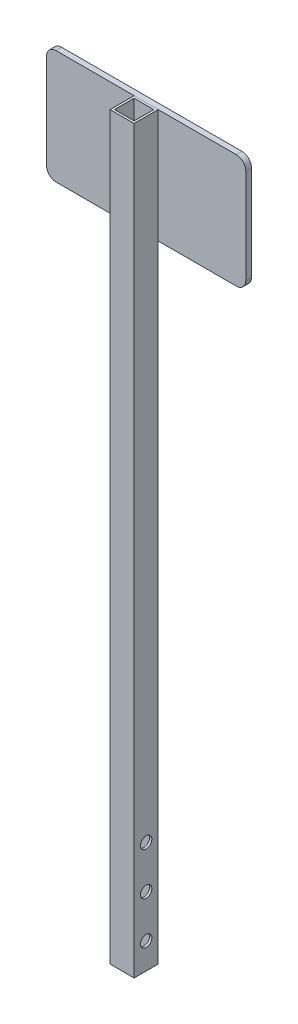
ISO-10303-21;
HEADER;
FILE_DESCRIPTION(('STEP AP214'),'2;1');
FILE_NAME('part.step','',(''),(''),'','','');
FILE_SCHEMA(('AUTOMOTIVE_DESIGN { 1 0 10303 214 1 1 1 1 }'));
ENDSEC;
DATA;
#1=APPLICATION_CONTEXT('core data for automotive mechanical design processes');
#2=APPLICATION_PROTOCOL_DEFINITION('international standard','automotive_design',2000,#1);
#3=PRODUCT_CONTEXT('',#1,'mechanical');
#4=PRODUCT('Part','Part','',(#3));
#5=PRODUCT_RELATED_PRODUCT_CATEGORY('part','',(#4));
#6=PRODUCT_DEFINITION_FORMATION('','',#4);
#7=PRODUCT_DEFINITION_CONTEXT('part definition',#1,'design');
#8=PRODUCT_DEFINITION('design','',#6,#7);
#9=PRODUCT_DEFINITION_SHAPE('','',#8);
#10=(LENGTH_UNIT() NAMED_UNIT(*) SI_UNIT(.MILLI.,.METRE.));
#11=(NAMED_UNIT(*) PLANE_ANGLE_UNIT() SI_UNIT($,.RADIAN.));
#12=(NAMED_UNIT(*) SI_UNIT($,.STERADIAN.) SOLID_ANGLE_UNIT());
#13=UNCERTAINTY_MEASURE_WITH_UNIT(LENGTH_MEASURE(1.E-05),#10,'distance_accuracy_value','');
#14=(GEOMETRIC_REPRESENTATION_CONTEXT(3) GLOBAL_UNCERTAINTY_ASSIGNED_CONTEXT((#13)) GLOBAL_UNIT_ASSIGNED_CONTEXT((#10,
#11,#12)) REPRESENTATION_CONTEXT('',''));
#15=CARTESIAN_POINT('',(0.,0.,0.));
#16=DIRECTION('',(0.,0.,1.));
#17=DIRECTION('',(1.,0.,0.));
#18=AXIS2_PLACEMENT_3D('',#15,#16,#17);
#19=CARTESIAN_POINT('',(47.5,-55.,-9.35000000000002));
#20=DIRECTION('',(0.,0.,1.));
#21=DIRECTION('',(0.,-1.,0.));
#22=AXIS2_PLACEMENT_3D('',#19,#20,#21);
#23=CYLINDRICAL_SURFACE('',#22,4.99999999999999);
#24=CARTESIAN_POINT('',(47.5,-55.,-6.35000000000002));
#25=DIRECTION('',(0.,0.,-1.));
#26=DIRECTION('',(0.,-1.,0.));
#27=AXIS2_PLACEMENT_3D('',#24,#25,#26);
#28=CIRCLE('',#27,4.99999999999999);
#29=CARTESIAN_POINT('',(52.5,-55.,-6.35000000000002));
#30=VERTEX_POINT('',#29);
#31=CARTESIAN_POINT('',(47.5,-60.,-6.35000000000003));
#32=VERTEX_POINT('',#31);
#33=EDGE_CURVE('E138',#30,#32,#28,.T.);
#34=ORIENTED_EDGE('',*,*,#33,.T.);
#35=DIRECTION('',(0.,0.,1.));
#36=VECTOR('',#35,1.);
#37=CARTESIAN_POINT('',(47.5,-60.,-9.35000000000003));
#38=LINE('',#37,#36);
#39=CARTESIAN_POINT('',(47.5,-60.,-9.35000000000003));
#40=VERTEX_POINT('',#39);
#41=EDGE_CURVE('E12',#40,#32,#38,.T.);
#42=ORIENTED_EDGE('',*,*,#41,.F.);
#43=CARTESIAN_POINT('',(47.5,-55.,-9.35000000000002));
#44=DIRECTION('',(0.,0.,-1.));
#45=DIRECTION('',(0.,-1.,0.));
#46=AXIS2_PLACEMENT_3D('',#43,#44,#45);
#47=CIRCLE('',#46,4.99999999999999);
#48=CARTESIAN_POINT('',(52.5,-55.,-9.35000000000002));
#49=VERTEX_POINT('',#48);
#50=EDGE_CURVE('E152',#49,#40,#47,.T.);
#51=ORIENTED_EDGE('',*,*,#50,.F.);
#52=DIRECTION('',(0.,0.,1.));
#53=VECTOR('',#52,1.);
#54=CARTESIAN_POINT('',(52.5,-55.,-9.35000000000002));
#55=LINE('',#54,#53);
#56=EDGE_CURVE('E134',#49,#30,#55,.T.);
#57=ORIENTED_EDGE('',*,*,#56,.T.);
#58=EDGE_LOOP('',(#34,#42,#51,#57));
#59=FACE_BOUND('',#58,.T.);
#60=ADVANCED_FACE('F42',(#59),#23,.T.);
#61=CARTESIAN_POINT('',(47.5,-60.,-9.35000000000003));
#62=DIRECTION('',(0.,1.,0.));
#63=DIRECTION('',(0.,0.,1.));
#64=AXIS2_PLACEMENT_3D('',#61,#62,#63);
#65=PLANE('',#64);
#66=DIRECTION('',(-1.,0.,0.));
#67=VECTOR('',#66,1.);
#68=CARTESIAN_POINT('',(47.5,-60.,-6.35000000000003));
#69=LINE('',#68,#67);
#70=CARTESIAN_POINT('',(-47.5,-60.,-6.35000000000003));
#71=VERTEX_POINT('',#70);
#72=EDGE_CURVE('E141',#32,#71,#69,.T.);
#73=ORIENTED_EDGE('',*,*,#72,.T.);
#74=DIRECTION('',(0.,0.,1.));
#75=VECTOR('',#74,1.);
#76=CARTESIAN_POINT('',(-47.5,-60.,-9.35000000000003));
#77=LINE('',#76,#75);
#78=CARTESIAN_POINT('',(-47.5,-60.,-9.35000000000003));
#79=VERTEX_POINT('',#78);
#80=EDGE_CURVE('E50',#79,#71,#77,.T.);
#81=ORIENTED_EDGE('',*,*,#80,.F.);
#82=DIRECTION('',(-1.,0.,0.));
#83=VECTOR('',#82,1.);
#84=CARTESIAN_POINT('',(47.5,-60.,-9.35000000000003));
#85=LINE('',#84,#83);
#86=EDGE_CURVE('E101',#40,#79,#85,.T.);
#87=ORIENTED_EDGE('',*,*,#86,.F.);
#88=ORIENTED_EDGE('',*,*,#41,.T.);
#89=EDGE_LOOP('',(#73,#81,#87,#88));
#90=FACE_BOUND('',#89,.T.);
#91=ADVANCED_FACE('F187',(#90),#65,.F.);
#92=CARTESIAN_POINT('',(-47.5,-55.,-9.35000000000002));
#93=DIRECTION('',(0.,0.,1.));
#94=DIRECTION('',(0.,-1.,0.));
#95=AXIS2_PLACEMENT_3D('',#92,#93,#94);
#96=CYLINDRICAL_SURFACE('',#95,4.99999999999999);
#97=CARTESIAN_POINT('',(-47.5,-55.,-6.35000000000002));
#98=DIRECTION('',(0.,0.,-1.));
#99=DIRECTION('',(0.,1.,0.));
#100=AXIS2_PLACEMENT_3D('',#97,#98,#99);
#101=CIRCLE('',#100,4.99999999999999);
#102=CARTESIAN_POINT('',(-52.5,-55.,-6.35000000000002));
#103=VERTEX_POINT('',#102);
#104=EDGE_CURVE('E143',#71,#103,#101,.T.);
#105=ORIENTED_EDGE('',*,*,#104,.T.);
#106=DIRECTION('',(0.,0.,1.));
#107=VECTOR('',#106,1.);
#108=CARTESIAN_POINT('',(-52.5,-55.,-9.35000000000002));
#109=LINE('',#108,#107);
#110=CARTESIAN_POINT('',(-52.5,-55.,-9.35000000000002));
#111=VERTEX_POINT('',#110);
#112=EDGE_CURVE('E159',#111,#103,#109,.T.);
#113=ORIENTED_EDGE('',*,*,#112,.F.);
#114=CARTESIAN_POINT('',(-47.5,-55.,-9.35000000000002));
#115=DIRECTION('',(0.,0.,-1.));
#116=DIRECTION('',(0.,1.,0.));
#117=AXIS2_PLACEMENT_3D('',#114,#115,#116);
#118=CIRCLE('',#117,4.99999999999999);
#119=EDGE_CURVE('E167',#79,#111,#118,.T.);
#120=ORIENTED_EDGE('',*,*,#119,.F.);
#121=ORIENTED_EDGE('',*,*,#80,.T.);
#122=EDGE_LOOP('',(#105,#113,#120,#121));
#123=FACE_BOUND('',#122,.T.);
#124=ADVANCED_FACE('F165',(#123),#96,.T.);
#125=CARTESIAN_POINT('',(-52.5,-55.,-9.35000000000002));
#126=DIRECTION('',(1.,0.,0.));
#127=DIRECTION('',(0.,1.,0.));
#128=AXIS2_PLACEMENT_3D('',#125,#126,#127);
#129=PLANE('',#128);
#130=DIRECTION('',(0.,1.,0.));
#131=VECTOR('',#130,1.);
#132=CARTESIAN_POINT('',(-52.5,-55.,-6.35000000000002));
#133=LINE('',#132,#131);
#134=CARTESIAN_POINT('',(-52.5,-4.99999999999999,-6.35));
#135=VERTEX_POINT('',#134);
#136=EDGE_CURVE('E145',#103,#135,#133,.T.);
#137=ORIENTED_EDGE('',*,*,#136,.T.);
#138=DIRECTION('',(0.,0.,1.));
#139=VECTOR('',#138,1.);
#140=CARTESIAN_POINT('',(-52.5,-4.99999999999999,-9.35));
#141=LINE('',#140,#139);
#142=CARTESIAN_POINT('',(-52.5,-4.99999999999999,-9.35));
#143=VERTEX_POINT('',#142);
#144=EDGE_CURVE('E156',#143,#135,#141,.T.);
#145=ORIENTED_EDGE('',*,*,#144,.F.);
#146=DIRECTION('',(0.,1.,0.));
#147=VECTOR('',#146,1.);
#148=CARTESIAN_POINT('',(-52.5,-55.,-9.35000000000002));
#149=LINE('',#148,#147);
#150=EDGE_CURVE('E179',#111,#143,#149,.T.);
#151=ORIENTED_EDGE('',*,*,#150,.F.);
#152=ORIENTED_EDGE('',*,*,#112,.T.);
#153=EDGE_LOOP('',(#137,#145,#151,#152));
#154=FACE_BOUND('',#153,.T.);
#155=ADVANCED_FACE('F175',(#154),#129,.F.);
#156=CARTESIAN_POINT('',(-47.5,-4.99999999999999,-9.35));
#157=DIRECTION('',(0.,0.,1.));
#158=DIRECTION('',(0.,-1.,0.));
#159=AXIS2_PLACEMENT_3D('',#156,#157,#158);
#160=CYLINDRICAL_SURFACE('',#159,5.);
#161=CARTESIAN_POINT('',(-47.5,-4.99999999999999,-6.35));
#162=DIRECTION('',(0.,0.,-1.));
#163=DIRECTION('',(0.,-1.,0.));
#164=AXIS2_PLACEMENT_3D('',#161,#162,#163);
#165=CIRCLE('',#164,5.);
#166=CARTESIAN_POINT('',(-47.5,0.,-6.35));
#167=VERTEX_POINT('',#166);
#168=EDGE_CURVE('E147',#135,#167,#165,.T.);
#169=ORIENTED_EDGE('',*,*,#168,.T.);
#170=DIRECTION('',(0.,0.,1.));
#171=VECTOR('',#170,1.);
#172=CARTESIAN_POINT('',(-47.5,0.,-9.35));
#173=LINE('',#172,#171);
#174=CARTESIAN_POINT('',(-47.5,0.,-9.35));
#175=VERTEX_POINT('',#174);
#176=EDGE_CURVE('E129',#175,#167,#173,.T.);
#177=ORIENTED_EDGE('',*,*,#176,.F.);
#178=CARTESIAN_POINT('',(-47.5,-4.99999999999999,-9.35));
#179=DIRECTION('',(0.,0.,-1.));
#180=DIRECTION('',(0.,-1.,0.));
#181=AXIS2_PLACEMENT_3D('',#178,#179,#180);
#182=CIRCLE('',#181,5.);
#183=EDGE_CURVE('E120',#143,#175,#182,.T.);
#184=ORIENTED_EDGE('',*,*,#183,.F.);
#185=ORIENTED_EDGE('',*,*,#144,.T.);
#186=EDGE_LOOP('',(#169,#177,#184,#185));
#187=FACE_BOUND('',#186,.T.);
#188=ADVANCED_FACE('F178',(#187),#160,.T.);
#189=CARTESIAN_POINT('',(47.5,0.,-9.35));
#190=DIRECTION('',(0.,-1.,0.));
#191=DIRECTION('',(0.,0.,-1.));
#192=AXIS2_PLACEMENT_3D('',#189,#190,#191);
#193=PLANE('',#192);
#194=DIRECTION('',(1.,0.,0.));
#195=VECTOR('',#194,1.);
#196=CARTESIAN_POINT('',(47.5,0.,-6.35));
#197=LINE('',#196,#195);
#198=CARTESIAN_POINT('',(47.5,0.,-6.35));
#199=VERTEX_POINT('',#198);
#200=EDGE_CURVE('E128',#167,#199,#197,.T.);
#201=ORIENTED_EDGE('',*,*,#200,.T.);
#202=DIRECTION('',(0.,0.,1.));
#203=VECTOR('',#202,1.);
#204=CARTESIAN_POINT('',(47.5,0.,-9.35));
#205=LINE('',#204,#203);
#206=CARTESIAN_POINT('',(47.5,0.,-9.35));
#207=VERTEX_POINT('',#206);
#208=EDGE_CURVE('E125',#207,#199,#205,.T.);
#209=ORIENTED_EDGE('',*,*,#208,.F.);
#210=DIRECTION('',(1.,0.,0.));
#211=VECTOR('',#210,1.);
#212=CARTESIAN_POINT('',(47.5,0.,-9.35));
#213=LINE('',#212,#211);
#214=EDGE_CURVE('E114',#175,#207,#213,.T.);
#215=ORIENTED_EDGE('',*,*,#214,.F.);
#216=ORIENTED_EDGE('',*,*,#176,.T.);
#217=EDGE_LOOP('',(#201,#209,#215,#216));
#218=FACE_BOUND('',#217,.T.);
#219=ADVANCED_FACE('F126',(#218),#193,.F.);
#220=CARTESIAN_POINT('',(47.5,-4.99999999999999,-9.35));
#221=DIRECTION('',(0.,0.,1.));
#222=DIRECTION('',(0.,-1.,0.));
#223=AXIS2_PLACEMENT_3D('',#220,#221,#222);
#224=CYLINDRICAL_SURFACE('',#223,5.);
#225=CARTESIAN_POINT('',(47.5,-4.99999999999999,-6.35));
#226=DIRECTION('',(0.,0.,-1.));
#227=DIRECTION('',(0.,-1.,0.));
#228=AXIS2_PLACEMENT_3D('',#225,#226,#227);
#229=CIRCLE('',#228,5.);
#230=CARTESIAN_POINT('',(52.5,-4.99999999999999,-6.35));
#231=VERTEX_POINT('',#230);
#232=EDGE_CURVE('E87',#199,#231,#229,.T.);
#233=ORIENTED_EDGE('',*,*,#232,.T.);
#234=DIRECTION('',(0.,0.,1.));
#235=VECTOR('',#234,1.);
#236=CARTESIAN_POINT('',(52.5,-4.99999999999999,-9.35));
#237=LINE('',#236,#235);
#238=CARTESIAN_POINT('',(52.5,-4.99999999999999,-9.35));
#239=VERTEX_POINT('',#238);
#240=EDGE_CURVE('E130',#239,#231,#237,.T.);
#241=ORIENTED_EDGE('',*,*,#240,.F.);
#242=CARTESIAN_POINT('',(47.5,-4.99999999999999,-9.35));
#243=DIRECTION('',(0.,0.,-1.));
#244=DIRECTION('',(0.,-1.,0.));
#245=AXIS2_PLACEMENT_3D('',#242,#243,#244);
#246=CIRCLE('',#245,5.);
#247=EDGE_CURVE('E118',#207,#239,#246,.T.);
#248=ORIENTED_EDGE('',*,*,#247,.F.);
#249=ORIENTED_EDGE('',*,*,#208,.T.);
#250=EDGE_LOOP('',(#233,#241,#248,#249));
#251=FACE_BOUND('',#250,.T.);
#252=ADVANCED_FACE('F132',(#251),#224,.T.);
#253=CARTESIAN_POINT('',(52.5,-55.,-9.35000000000002));
#254=DIRECTION('',(-1.,0.,0.));
#255=DIRECTION('',(0.,-1.,0.));
#256=AXIS2_PLACEMENT_3D('',#253,#254,#255);
#257=PLANE('',#256);
#258=DIRECTION('',(0.,-1.,0.));
#259=VECTOR('',#258,1.);
#260=CARTESIAN_POINT('',(52.5,-55.,-6.35000000000002));
#261=LINE('',#260,#259);
#262=EDGE_CURVE('E93',#231,#30,#261,.T.);
#263=ORIENTED_EDGE('',*,*,#262,.T.);
#264=ORIENTED_EDGE('',*,*,#56,.F.);
#265=DIRECTION('',(0.,-1.,0.));
#266=VECTOR('',#265,1.);
#267=CARTESIAN_POINT('',(52.5,-55.,-9.35000000000002));
#268=LINE('',#267,#266);
#269=EDGE_CURVE('E58',#239,#49,#268,.T.);
#270=ORIENTED_EDGE('',*,*,#269,.F.);
#271=ORIENTED_EDGE('',*,*,#240,.T.);
#272=EDGE_LOOP('',(#263,#264,#270,#271));
#273=FACE_BOUND('',#272,.T.);
#274=ADVANCED_FACE('F203',(#273),#257,.F.);
#275=CARTESIAN_POINT('',(47.5,-55.,-9.35000000000002));
#276=DIRECTION('',(0.,0.,1.));
#277=DIRECTION('',(0.,-1.,0.));
#278=AXIS2_PLACEMENT_3D('',#275,#276,#277);
#279=PLANE('',#278);
#280=ORIENTED_EDGE('',*,*,#50,.T.);
#281=ORIENTED_EDGE('',*,*,#86,.T.);
#282=ORIENTED_EDGE('',*,*,#119,.T.);
#283=ORIENTED_EDGE('',*,*,#150,.T.);
#284=ORIENTED_EDGE('',*,*,#183,.T.);
#285=ORIENTED_EDGE('',*,*,#214,.T.);
#286=ORIENTED_EDGE('',*,*,#247,.T.);
#287=ORIENTED_EDGE('',*,*,#269,.T.);
#288=EDGE_LOOP('',(#280,#281,#282,#283,#284,#285,#286,#287));
#289=FACE_BOUND('',#288,.T.);
#290=ADVANCED_FACE('F116',(#289),#279,.F.);
#291=CARTESIAN_POINT('',(47.5,-55.,-6.35000000000002));
#292=DIRECTION('',(0.,0.,1.));
#293=DIRECTION('',(0.,-1.,0.));
#294=AXIS2_PLACEMENT_3D('',#291,#292,#293);
#295=PLANE('',#294);
#296=ORIENTED_EDGE('',*,*,#33,.F.);
#297=ORIENTED_EDGE('',*,*,#262,.F.);
#298=ORIENTED_EDGE('',*,*,#232,.F.);
#299=ORIENTED_EDGE('',*,*,#200,.F.);
#300=ORIENTED_EDGE('',*,*,#168,.F.);
#301=ORIENTED_EDGE('',*,*,#136,.F.);
#302=ORIENTED_EDGE('',*,*,#104,.F.);
#303=ORIENTED_EDGE('',*,*,#72,.F.);
#304=EDGE_LOOP('',(#296,#297,#298,#299,#300,#301,#302,#303));
#305=FACE_BOUND('',#304,.T.);
#306=ADVANCED_FACE('F171',(#305),#295,.T.);
#307=CLOSED_SHELL('',(#60,#91,#124,#155,#188,#219,#252,#274,#290,#306));
#308=MANIFOLD_SOLID_BREP('B2',#307);
#309=CARTESIAN_POINT('',(6.35,0.,0.));
#310=DIRECTION('',(0.,1.,0.));
#311=DIRECTION('',(0.,0.,1.));
#312=AXIS2_PLACEMENT_3D('',#309,#310,#311);
#313=PLANE('',#312);
#314=DIRECTION('',(0.,0.,-1.));
#315=VECTOR('',#314,1.);
#316=CARTESIAN_POINT('',(-6.35,0.,0.));
#317=LINE('',#316,#315);
#318=CARTESIAN_POINT('',(-6.35,0.,6.35));
#319=VERTEX_POINT('',#318);
#320=CARTESIAN_POINT('',(-6.35,0.,-6.35));
#321=VERTEX_POINT('',#320);
#322=EDGE_CURVE('E384',#319,#321,#317,.T.);
#323=ORIENTED_EDGE('',*,*,#322,.F.);
#324=DIRECTION('',(-1.,0.,0.));
#325=VECTOR('',#324,1.);
#326=CARTESIAN_POINT('',(6.35,0.,6.35));
#327=LINE('',#326,#325);
#328=CARTESIAN_POINT('',(6.35,0.,6.35));
#329=VERTEX_POINT('',#328);
#330=EDGE_CURVE('E278',#329,#319,#327,.T.);
#331=ORIENTED_EDGE('',*,*,#330,.F.);
#332=DIRECTION('',(0.,0.,-1.));
#333=VECTOR('',#332,1.);
#334=CARTESIAN_POINT('',(6.35,0.,0.));
#335=LINE('',#334,#333);
#336=CARTESIAN_POINT('',(6.35,0.,-6.35));
#337=VERTEX_POINT('',#336);
#338=EDGE_CURVE('E373',#329,#337,#335,.T.);
#339=ORIENTED_EDGE('',*,*,#338,.T.);
#340=DIRECTION('',(-1.,0.,0.));
#341=VECTOR('',#340,1.);
#342=CARTESIAN_POINT('',(6.35,0.,-6.35));
#343=LINE('',#342,#341);
#344=EDGE_CURVE('E40',#337,#321,#343,.T.);
#345=ORIENTED_EDGE('',*,*,#344,.T.);
#346=EDGE_LOOP('',(#323,#331,#339,#345));
#347=FACE_BOUND('',#346,.T.);
#348=DIRECTION('',(-1.,0.,0.));
#349=VECTOR('',#348,1.);
#350=CARTESIAN_POINT('',(6.35,0.,5.15));
#351=LINE('',#350,#349);
#352=CARTESIAN_POINT('',(5.15,0.,5.15));
#353=VERTEX_POINT('',#352);
#354=CARTESIAN_POINT('',(-5.15,0.,5.15));
#355=VERTEX_POINT('',#354);
#356=EDGE_CURVE('E345',#353,#355,#351,.T.);
#357=ORIENTED_EDGE('',*,*,#356,.T.);
#358=DIRECTION('',(0.,0.,-1.));
#359=VECTOR('',#358,1.);
#360=CARTESIAN_POINT('',(-5.15,0.,0.));
#361=LINE('',#360,#359);
#362=CARTESIAN_POINT('',(-5.15,0.,-5.15));
#363=VERTEX_POINT('',#362);
#364=EDGE_CURVE('E350',#355,#363,#361,.T.);
#365=ORIENTED_EDGE('',*,*,#364,.T.);
#366=DIRECTION('',(-1.,0.,0.));
#367=VECTOR('',#366,1.);
#368=CARTESIAN_POINT('',(6.35,0.,-5.15));
#369=LINE('',#368,#367);
#370=CARTESIAN_POINT('',(5.15,0.,-5.15));
#371=VERTEX_POINT('',#370);
#372=EDGE_CURVE('E336',#371,#363,#369,.T.);
#373=ORIENTED_EDGE('',*,*,#372,.F.);
#374=DIRECTION('',(0.,0.,-1.));
#375=VECTOR('',#374,1.);
#376=CARTESIAN_POINT('',(5.15,0.,0.));
#377=LINE('',#376,#375);
#378=EDGE_CURVE('E286',#353,#371,#377,.T.);
#379=ORIENTED_EDGE('',*,*,#378,.F.);
#380=EDGE_LOOP('',(#357,#365,#373,#379));
#381=FACE_BOUND('',#380,.T.);
#382=ADVANCED_FACE('F269',(#347,#381),#313,.T.);
#383=CARTESIAN_POINT('',(6.35,-390.,0.));
#384=DIRECTION('',(0.,1.,0.));
#385=DIRECTION('',(0.,0.,1.));
#386=AXIS2_PLACEMENT_3D('',#383,#384,#385);
#387=PLANE('',#386);
#388=DIRECTION('',(0.,0.,-1.));
#389=VECTOR('',#388,1.);
#390=CARTESIAN_POINT('',(-6.35,-390.,0.));
#391=LINE('',#390,#389);
#392=CARTESIAN_POINT('',(-6.35,-390.,6.35000000000005));
#393=VERTEX_POINT('',#392);
#394=CARTESIAN_POINT('',(-6.35,-390.,-6.35000000000019));
#395=VERTEX_POINT('',#394);
#396=EDGE_CURVE('E374',#393,#395,#391,.T.);
#397=ORIENTED_EDGE('',*,*,#396,.T.);
#398=DIRECTION('',(-1.,0.,0.));
#399=VECTOR('',#398,1.);
#400=CARTESIAN_POINT('',(6.35,-390.,-6.35000000000019));
#401=LINE('',#400,#399);
#402=CARTESIAN_POINT('',(6.35,-390.,-6.35000000000019));
#403=VERTEX_POINT('',#402);
#404=EDGE_CURVE('E381',#403,#395,#401,.T.);
#405=ORIENTED_EDGE('',*,*,#404,.F.);
#406=DIRECTION('',(0.,0.,-1.));
#407=VECTOR('',#406,1.);
#408=CARTESIAN_POINT('',(6.35,-390.,0.));
#409=LINE('',#408,#407);
#410=CARTESIAN_POINT('',(6.35,-390.,6.35000000000005));
#411=VERTEX_POINT('',#410);
#412=EDGE_CURVE('E379',#411,#403,#409,.T.);
#413=ORIENTED_EDGE('',*,*,#412,.F.);
#414=DIRECTION('',(-1.,0.,0.));
#415=VECTOR('',#414,1.);
#416=CARTESIAN_POINT('',(6.35,-390.,6.35000000000005));
#417=LINE('',#416,#415);
#418=EDGE_CURVE('E392',#411,#393,#417,.T.);
#419=ORIENTED_EDGE('',*,*,#418,.T.);
#420=EDGE_LOOP('',(#397,#405,#413,#419));
#421=FACE_BOUND('',#420,.T.);
#422=DIRECTION('',(0.,0.,-1.));
#423=VECTOR('',#422,1.);
#424=CARTESIAN_POINT('',(-5.15,-390.,0.));
#425=LINE('',#424,#423);
#426=CARTESIAN_POINT('',(-5.15,-390.,5.15000000000005));
#427=VERTEX_POINT('',#426);
#428=CARTESIAN_POINT('',(-5.15,-390.,-5.15000000000019));
#429=VERTEX_POINT('',#428);
#430=EDGE_CURVE('E353',#427,#429,#425,.T.);
#431=ORIENTED_EDGE('',*,*,#430,.F.);
#432=DIRECTION('',(-1.,0.,0.));
#433=VECTOR('',#432,1.);
#434=CARTESIAN_POINT('',(6.35,-390.,5.15000000000005));
#435=LINE('',#434,#433);
#436=CARTESIAN_POINT('',(5.15,-390.,5.15000000000005));
#437=VERTEX_POINT('',#436);
#438=EDGE_CURVE('E361',#437,#427,#435,.T.);
#439=ORIENTED_EDGE('',*,*,#438,.F.);
#440=DIRECTION('',(0.,0.,-1.));
#441=VECTOR('',#440,1.);
#442=CARTESIAN_POINT('',(5.15,-390.,0.));
#443=LINE('',#442,#441);
#444=CARTESIAN_POINT('',(5.15,-390.,-5.15000000000019));
#445=VERTEX_POINT('',#444);
#446=EDGE_CURVE('E291',#437,#445,#443,.T.);
#447=ORIENTED_EDGE('',*,*,#446,.T.);
#448=DIRECTION('',(-1.,0.,0.));
#449=VECTOR('',#448,1.);
#450=CARTESIAN_POINT('',(6.35,-390.,-5.15000000000019));
#451=LINE('',#450,#449);
#452=EDGE_CURVE('E364',#445,#429,#451,.T.);
#453=ORIENTED_EDGE('',*,*,#452,.T.);
#454=EDGE_LOOP('',(#431,#439,#447,#453));
#455=FACE_BOUND('',#454,.T.);
#456=ADVANCED_FACE('F422',(#421,#455),#387,.F.);
#457=CARTESIAN_POINT('',(6.35,0.,-6.35));
#458=DIRECTION('',(0.,0.,-1.));
#459=DIRECTION('',(0.,1.,0.));
#460=AXIS2_PLACEMENT_3D('',#457,#458,#459);
#461=PLANE('',#460);
#462=DIRECTION('',(0.,-1.,0.));
#463=VECTOR('',#462,1.);
#464=CARTESIAN_POINT('',(-6.35,0.,-6.35));
#465=LINE('',#464,#463);
#466=EDGE_CURVE('E344',#321,#395,#465,.T.);
#467=ORIENTED_EDGE('',*,*,#466,.F.);
#468=ORIENTED_EDGE('',*,*,#344,.F.);
#469=DIRECTION('',(0.,-1.,0.));
#470=VECTOR('',#469,1.);
#471=CARTESIAN_POINT('',(6.35,0.,-6.35));
#472=LINE('',#471,#470);
#473=EDGE_CURVE('E370',#337,#403,#472,.T.);
#474=ORIENTED_EDGE('',*,*,#473,.T.);
#475=ORIENTED_EDGE('',*,*,#404,.T.);
#476=EDGE_LOOP('',(#467,#468,#474,#475));
#477=FACE_BOUND('',#476,.T.);
#478=ADVANCED_FACE('F271',(#477),#461,.T.);
#479=CARTESIAN_POINT('',(6.35,0.,6.35));
#480=DIRECTION('',(0.,0.,-1.));
#481=DIRECTION('',(0.,1.,0.));
#482=AXIS2_PLACEMENT_3D('',#479,#480,#481);
#483=PLANE('',#482);
#484=DIRECTION('',(0.,-1.,0.));
#485=VECTOR('',#484,1.);
#486=CARTESIAN_POINT('',(-6.35,0.,6.35));
#487=LINE('',#486,#485);
#488=EDGE_CURVE('E387',#319,#393,#487,.T.);
#489=ORIENTED_EDGE('',*,*,#488,.T.);
#490=ORIENTED_EDGE('',*,*,#418,.F.);
#491=DIRECTION('',(0.,-1.,0.));
#492=VECTOR('',#491,1.);
#493=CARTESIAN_POINT('',(6.35,0.,6.35));
#494=LINE('',#493,#492);
#495=EDGE_CURVE('E377',#329,#411,#494,.T.);
#496=ORIENTED_EDGE('',*,*,#495,.F.);
#497=ORIENTED_EDGE('',*,*,#330,.T.);
#498=EDGE_LOOP('',(#489,#490,#496,#497));
#499=FACE_BOUND('',#498,.T.);
#500=ADVANCED_FACE('F445',(#499),#483,.F.);
#501=CARTESIAN_POINT('',(6.35,0.,0.));
#502=DIRECTION('',(1.,0.,0.));
#503=DIRECTION('',(0.,0.,-1.));
#504=AXIS2_PLACEMENT_3D('',#501,#502,#503);
#505=PLANE('',#504);
#506=CARTESIAN_POINT('',(6.35,-376.25,0.));
#507=DIRECTION('',(1.,0.,0.));
#508=DIRECTION('',(0.,0.,-1.));
#509=AXIS2_PLACEMENT_3D('',#506,#507,#508);
#510=CIRCLE('',#509,3.);
#511=CARTESIAN_POINT('',(6.35,-376.25,-3.00000000000007));
#512=VERTEX_POINT('',#511);
#513=EDGE_CURVE('E461',#512,#512,#510,.T.);
#514=ORIENTED_EDGE('',*,*,#513,.F.);
#515=EDGE_LOOP('',(#514));
#516=FACE_BOUND('',#515,.T.);
#517=CARTESIAN_POINT('',(6.35,-353.75,0.));
#518=DIRECTION('',(1.,0.,0.));
#519=DIRECTION('',(0.,0.,-1.));
#520=AXIS2_PLACEMENT_3D('',#517,#518,#519);
#521=CIRCLE('',#520,3.);
#522=CARTESIAN_POINT('',(6.35,-353.75,-3.));
#523=VERTEX_POINT('',#522);
#524=EDGE_CURVE('E465',#523,#523,#521,.T.);
#525=ORIENTED_EDGE('',*,*,#524,.F.);
#526=EDGE_LOOP('',(#525));
#527=FACE_BOUND('',#526,.T.);
#528=CARTESIAN_POINT('',(6.35,-331.25,0.));
#529=DIRECTION('',(1.,0.,0.));
#530=DIRECTION('',(0.,0.,-1.));
#531=AXIS2_PLACEMENT_3D('',#528,#529,#530);
#532=CIRCLE('',#531,3.);
#533=CARTESIAN_POINT('',(6.35,-331.25,-2.99999999999992));
#534=VERTEX_POINT('',#533);
#535=EDGE_CURVE('E412',#534,#534,#532,.T.);
#536=ORIENTED_EDGE('',*,*,#535,.F.);
#537=EDGE_LOOP('',(#536));
#538=FACE_BOUND('',#537,.T.);
#539=ORIENTED_EDGE('',*,*,#473,.F.);
#540=ORIENTED_EDGE('',*,*,#338,.F.);
#541=ORIENTED_EDGE('',*,*,#495,.T.);
#542=ORIENTED_EDGE('',*,*,#412,.T.);
#543=EDGE_LOOP('',(#539,#540,#541,#542));
#544=FACE_BOUND('',#543,.T.);
#545=ADVANCED_FACE('F447',(#516,#527,#538,#544),#505,.T.);
#546=CARTESIAN_POINT('',(-6.35,0.,0.));
#547=DIRECTION('',(1.,0.,0.));
#548=DIRECTION('',(0.,0.,-1.));
#549=AXIS2_PLACEMENT_3D('',#546,#547,#548);
#550=PLANE('',#549);
#551=CARTESIAN_POINT('',(-6.35,-376.25,0.));
#552=DIRECTION('',(1.,0.,0.));
#553=DIRECTION('',(0.,0.,-1.));
#554=AXIS2_PLACEMENT_3D('',#551,#552,#553);
#555=CIRCLE('',#554,3.);
#556=CARTESIAN_POINT('',(-6.35,-376.25,-3.00000000000007));
#557=VERTEX_POINT('',#556);
#558=EDGE_CURVE('E399',#557,#557,#555,.T.);
#559=ORIENTED_EDGE('',*,*,#558,.T.);
#560=EDGE_LOOP('',(#559));
#561=FACE_BOUND('',#560,.T.);
#562=CARTESIAN_POINT('',(-6.35,-353.75,0.));
#563=DIRECTION('',(1.,0.,0.));
#564=DIRECTION('',(0.,0.,-1.));
#565=AXIS2_PLACEMENT_3D('',#562,#563,#564);
#566=CIRCLE('',#565,3.);
#567=CARTESIAN_POINT('',(-6.35,-353.75,-3.));
#568=VERTEX_POINT('',#567);
#569=EDGE_CURVE('E595',#568,#568,#566,.T.);
#570=ORIENTED_EDGE('',*,*,#569,.T.);
#571=EDGE_LOOP('',(#570));
#572=FACE_BOUND('',#571,.T.);
#573=CARTESIAN_POINT('',(-6.35,-331.25,0.));
#574=DIRECTION('',(1.,0.,0.));
#575=DIRECTION('',(0.,0.,-1.));
#576=AXIS2_PLACEMENT_3D('',#573,#574,#575);
#577=CIRCLE('',#576,3.);
#578=CARTESIAN_POINT('',(-6.35,-331.25,-2.99999999999992));
#579=VERTEX_POINT('',#578);
#580=EDGE_CURVE('E599',#579,#579,#577,.T.);
#581=ORIENTED_EDGE('',*,*,#580,.T.);
#582=EDGE_LOOP('',(#581));
#583=FACE_BOUND('',#582,.T.);
#584=ORIENTED_EDGE('',*,*,#466,.T.);
#585=ORIENTED_EDGE('',*,*,#396,.F.);
#586=ORIENTED_EDGE('',*,*,#488,.F.);
#587=ORIENTED_EDGE('',*,*,#322,.T.);
#588=EDGE_LOOP('',(#584,#585,#586,#587));
#589=FACE_BOUND('',#588,.T.);
#590=ADVANCED_FACE('F450',(#561,#572,#583,#589),#550,.F.);
#591=CARTESIAN_POINT('',(6.35,0.,-5.15));
#592=DIRECTION('',(0.,0.,-1.));
#593=DIRECTION('',(0.,1.,0.));
#594=AXIS2_PLACEMENT_3D('',#591,#592,#593);
#595=PLANE('',#594);
#596=DIRECTION('',(0.,-1.,0.));
#597=VECTOR('',#596,1.);
#598=CARTESIAN_POINT('',(-5.15,0.,-5.15));
#599=LINE('',#598,#597);
#600=EDGE_CURVE('E339',#363,#429,#599,.T.);
#601=ORIENTED_EDGE('',*,*,#600,.T.);
#602=ORIENTED_EDGE('',*,*,#452,.F.);
#603=DIRECTION('',(0.,-1.,0.));
#604=VECTOR('',#603,1.);
#605=CARTESIAN_POINT('',(5.15,0.,-5.15));
#606=LINE('',#605,#604);
#607=EDGE_CURVE('E341',#371,#445,#606,.T.);
#608=ORIENTED_EDGE('',*,*,#607,.F.);
#609=ORIENTED_EDGE('',*,*,#372,.T.);
#610=EDGE_LOOP('',(#601,#602,#608,#609));
#611=FACE_BOUND('',#610,.T.);
#612=ADVANCED_FACE('F338',(#611),#595,.F.);
#613=CARTESIAN_POINT('',(6.35,0.,5.15));
#614=DIRECTION('',(0.,0.,-1.));
#615=DIRECTION('',(0.,1.,0.));
#616=AXIS2_PLACEMENT_3D('',#613,#614,#615);
#617=PLANE('',#616);
#618=DIRECTION('',(0.,-1.,0.));
#619=VECTOR('',#618,1.);
#620=CARTESIAN_POINT('',(-5.15,0.,5.15));
#621=LINE('',#620,#619);
#622=EDGE_CURVE('E356',#355,#427,#621,.T.);
#623=ORIENTED_EDGE('',*,*,#622,.F.);
#624=ORIENTED_EDGE('',*,*,#356,.F.);
#625=DIRECTION('',(0.,-1.,0.));
#626=VECTOR('',#625,1.);
#627=CARTESIAN_POINT('',(5.15,0.,5.15));
#628=LINE('',#627,#626);
#629=EDGE_CURVE('E363',#353,#437,#628,.T.);
#630=ORIENTED_EDGE('',*,*,#629,.T.);
#631=ORIENTED_EDGE('',*,*,#438,.T.);
#632=EDGE_LOOP('',(#623,#624,#630,#631));
#633=FACE_BOUND('',#632,.T.);
#634=ADVANCED_FACE('F420',(#633),#617,.T.);
#635=CARTESIAN_POINT('',(5.15,0.,0.));
#636=DIRECTION('',(1.,0.,0.));
#637=DIRECTION('',(0.,0.,-1.));
#638=AXIS2_PLACEMENT_3D('',#635,#636,#637);
#639=PLANE('',#638);
#640=CARTESIAN_POINT('',(5.15,-376.25,0.));
#641=DIRECTION('',(1.,0.,0.));
#642=DIRECTION('',(0.,0.,-1.));
#643=AXIS2_PLACEMENT_3D('',#640,#641,#642);
#644=CIRCLE('',#643,3.);
#645=CARTESIAN_POINT('',(5.15,-376.25,-3.00000000000007));
#646=VERTEX_POINT('',#645);
#647=EDGE_CURVE('E354',#646,#646,#644,.T.);
#648=ORIENTED_EDGE('',*,*,#647,.T.);
#649=EDGE_LOOP('',(#648));
#650=FACE_BOUND('',#649,.T.);
#651=CARTESIAN_POINT('',(5.15,-353.75,0.));
#652=DIRECTION('',(1.,0.,0.));
#653=DIRECTION('',(0.,0.,-1.));
#654=AXIS2_PLACEMENT_3D('',#651,#652,#653);
#655=CIRCLE('',#654,3.);
#656=CARTESIAN_POINT('',(5.15,-353.75,-3.));
#657=VERTEX_POINT('',#656);
#658=EDGE_CURVE('E402',#657,#657,#655,.T.);
#659=ORIENTED_EDGE('',*,*,#658,.T.);
#660=EDGE_LOOP('',(#659));
#661=FACE_BOUND('',#660,.T.);
#662=CARTESIAN_POINT('',(5.15,-331.25,0.));
#663=DIRECTION('',(1.,0.,0.));
#664=DIRECTION('',(0.,0.,-1.));
#665=AXIS2_PLACEMENT_3D('',#662,#663,#664);
#666=CIRCLE('',#665,3.);
#667=CARTESIAN_POINT('',(5.15,-331.25,-2.99999999999992));
#668=VERTEX_POINT('',#667);
#669=EDGE_CURVE('E398',#668,#668,#666,.T.);
#670=ORIENTED_EDGE('',*,*,#669,.T.);
#671=EDGE_LOOP('',(#670));
#672=FACE_BOUND('',#671,.T.);
#673=ORIENTED_EDGE('',*,*,#607,.T.);
#674=ORIENTED_EDGE('',*,*,#446,.F.);
#675=ORIENTED_EDGE('',*,*,#629,.F.);
#676=ORIENTED_EDGE('',*,*,#378,.T.);
#677=EDGE_LOOP('',(#673,#674,#675,#676));
#678=FACE_BOUND('',#677,.T.);
#679=ADVANCED_FACE('F423',(#650,#661,#672,#678),#639,.F.);
#680=CARTESIAN_POINT('',(-5.15,0.,0.));
#681=DIRECTION('',(1.,0.,0.));
#682=DIRECTION('',(0.,0.,-1.));
#683=AXIS2_PLACEMENT_3D('',#680,#681,#682);
#684=PLANE('',#683);
#685=CARTESIAN_POINT('',(-5.15,-376.25,0.));
#686=DIRECTION('',(1.,0.,0.));
#687=DIRECTION('',(0.,0.,-1.));
#688=AXIS2_PLACEMENT_3D('',#685,#686,#687);
#689=CIRCLE('',#688,3.);
#690=CARTESIAN_POINT('',(-5.15,-376.25,-3.00000000000007));
#691=VERTEX_POINT('',#690);
#692=EDGE_CURVE('E273',#691,#691,#689,.T.);
#693=ORIENTED_EDGE('',*,*,#692,.F.);
#694=EDGE_LOOP('',(#693));
#695=FACE_BOUND('',#694,.T.);
#696=CARTESIAN_POINT('',(-5.15,-353.75,0.));
#697=DIRECTION('',(1.,0.,0.));
#698=DIRECTION('',(0.,0.,-1.));
#699=AXIS2_PLACEMENT_3D('',#696,#697,#698);
#700=CIRCLE('',#699,3.);
#701=CARTESIAN_POINT('',(-5.15,-353.75,-3.));
#702=VERTEX_POINT('',#701);
#703=EDGE_CURVE('E400',#702,#702,#700,.T.);
#704=ORIENTED_EDGE('',*,*,#703,.F.);
#705=EDGE_LOOP('',(#704));
#706=FACE_BOUND('',#705,.T.);
#707=CARTESIAN_POINT('',(-5.15,-331.25,0.));
#708=DIRECTION('',(1.,0.,0.));
#709=DIRECTION('',(0.,0.,-1.));
#710=AXIS2_PLACEMENT_3D('',#707,#708,#709);
#711=CIRCLE('',#710,3.);
#712=CARTESIAN_POINT('',(-5.15,-331.25,-2.99999999999992));
#713=VERTEX_POINT('',#712);
#714=EDGE_CURVE('E396',#713,#713,#711,.T.);
#715=ORIENTED_EDGE('',*,*,#714,.F.);
#716=EDGE_LOOP('',(#715));
#717=FACE_BOUND('',#716,.T.);
#718=ORIENTED_EDGE('',*,*,#600,.F.);
#719=ORIENTED_EDGE('',*,*,#364,.F.);
#720=ORIENTED_EDGE('',*,*,#622,.T.);
#721=ORIENTED_EDGE('',*,*,#430,.T.);
#722=EDGE_LOOP('',(#718,#719,#720,#721));
#723=FACE_BOUND('',#722,.T.);
#724=ADVANCED_FACE('F349',(#695,#706,#717,#723),#684,.T.);
#725=CARTESIAN_POINT('',(-6.35,-331.25,0.));
#726=DIRECTION('',(1.,0.,0.));
#727=DIRECTION('',(0.,0.,-1.));
#728=AXIS2_PLACEMENT_3D('',#725,#726,#727);
#729=CYLINDRICAL_SURFACE('',#728,3.);
#730=ORIENTED_EDGE('',*,*,#714,.T.);
#731=EDGE_LOOP('',(#730));
#732=FACE_BOUND('',#731,.T.);
#733=ORIENTED_EDGE('',*,*,#580,.F.);
#734=EDGE_LOOP('',(#733));
#735=FACE_BOUND('',#734,.T.);
#736=ADVANCED_FACE('F431',(#732,#735),#729,.F.);
#737=CARTESIAN_POINT('',(-6.35,-353.75,0.));
#738=DIRECTION('',(1.,0.,0.));
#739=DIRECTION('',(0.,0.,-1.));
#740=AXIS2_PLACEMENT_3D('',#737,#738,#739);
#741=CYLINDRICAL_SURFACE('',#740,3.);
#742=ORIENTED_EDGE('',*,*,#703,.T.);
#743=EDGE_LOOP('',(#742));
#744=FACE_BOUND('',#743,.T.);
#745=ORIENTED_EDGE('',*,*,#569,.F.);
#746=EDGE_LOOP('',(#745));
#747=FACE_BOUND('',#746,.T.);
#748=ADVANCED_FACE('F540',(#744,#747),#741,.F.);
#749=CARTESIAN_POINT('',(-6.35,-376.25,0.));
#750=DIRECTION('',(1.,0.,0.));
#751=DIRECTION('',(0.,0.,-1.));
#752=AXIS2_PLACEMENT_3D('',#749,#750,#751);
#753=CYLINDRICAL_SURFACE('',#752,3.);
#754=ORIENTED_EDGE('',*,*,#692,.T.);
#755=EDGE_LOOP('',(#754));
#756=FACE_BOUND('',#755,.T.);
#757=ORIENTED_EDGE('',*,*,#558,.F.);
#758=EDGE_LOOP('',(#757));
#759=FACE_BOUND('',#758,.T.);
#760=ADVANCED_FACE('F551',(#756,#759),#753,.F.);
#761=ORIENTED_EDGE('',*,*,#535,.T.);
#762=EDGE_LOOP('',(#761));
#763=FACE_BOUND('',#762,.T.);
#764=ORIENTED_EDGE('',*,*,#669,.F.);
#765=EDGE_LOOP('',(#764));
#766=FACE_BOUND('',#765,.T.);
#767=ADVANCED_FACE('F543',(#763,#766),#729,.F.);
#768=ORIENTED_EDGE('',*,*,#524,.T.);
#769=EDGE_LOOP('',(#768));
#770=FACE_BOUND('',#769,.T.);
#771=ORIENTED_EDGE('',*,*,#658,.F.);
#772=EDGE_LOOP('',(#771));
#773=FACE_BOUND('',#772,.T.);
#774=ADVANCED_FACE('F553',(#770,#773),#741,.F.);
#775=ORIENTED_EDGE('',*,*,#513,.T.);
#776=EDGE_LOOP('',(#775));
#777=FACE_BOUND('',#776,.T.);
#778=ORIENTED_EDGE('',*,*,#647,.F.);
#779=EDGE_LOOP('',(#778));
#780=FACE_BOUND('',#779,.T.);
#781=ADVANCED_FACE('F563',(#777,#780),#753,.F.);
#782=CLOSED_SHELL('',(#382,#456,#478,#500,#545,#590,#612,#634,#679,#724,#736,#748,#760,#767,
#774,#781));
#783=MANIFOLD_SOLID_BREP('B6',#782);
#784=ADVANCED_BREP_SHAPE_REPRESENTATION('',(#18,#308,#783),#14);
#785=SHAPE_DEFINITION_REPRESENTATION(#9,#784);
ENDSEC;
END-ISO-10303-21;
